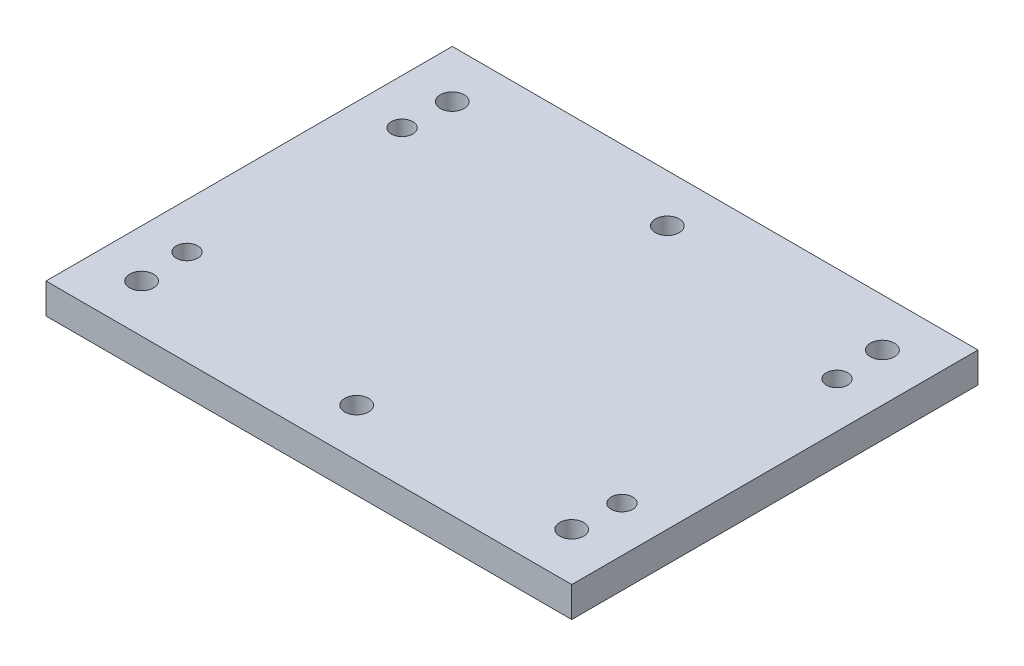
ISO-10303-21;
HEADER;
FILE_DESCRIPTION(('STEP AP214'),'2;1');
FILE_NAME('part.step','',(''),(''),'','','');
FILE_SCHEMA(('AUTOMOTIVE_DESIGN { 1 0 10303 214 1 1 1 1 }'));
ENDSEC;
DATA;
#1=APPLICATION_CONTEXT('core data for automotive mechanical design processes');
#2=APPLICATION_PROTOCOL_DEFINITION('international standard','automotive_design',2000,#1);
#3=PRODUCT_CONTEXT('',#1,'mechanical');
#4=PRODUCT('Part','Part','',(#3));
#5=PRODUCT_RELATED_PRODUCT_CATEGORY('part','',(#4));
#6=PRODUCT_DEFINITION_FORMATION('','',#4);
#7=PRODUCT_DEFINITION_CONTEXT('part definition',#1,'design');
#8=PRODUCT_DEFINITION('design','',#6,#7);
#9=PRODUCT_DEFINITION_SHAPE('','',#8);
#10=(LENGTH_UNIT() NAMED_UNIT(*) SI_UNIT(.MILLI.,.METRE.));
#11=(NAMED_UNIT(*) PLANE_ANGLE_UNIT() SI_UNIT($,.RADIAN.));
#12=(NAMED_UNIT(*) SI_UNIT($,.STERADIAN.) SOLID_ANGLE_UNIT());
#13=UNCERTAINTY_MEASURE_WITH_UNIT(LENGTH_MEASURE(1.E-05),#10,'distance_accuracy_value','');
#14=(GEOMETRIC_REPRESENTATION_CONTEXT(3) GLOBAL_UNCERTAINTY_ASSIGNED_CONTEXT((#13)) GLOBAL_UNIT_ASSIGNED_CONTEXT((#10,
#11,#12)) REPRESENTATION_CONTEXT('',''));
#15=CARTESIAN_POINT('',(0.,0.,0.));
#16=DIRECTION('',(0.,0.,1.));
#17=DIRECTION('',(1.,0.,0.));
#18=AXIS2_PLACEMENT_3D('',#15,#16,#17);
#19=CARTESIAN_POINT('',(55.,-3.175,-42.5));
#20=DIRECTION('',(1.,0.,0.));
#21=DIRECTION('',(0.,0.,-1.));
#22=AXIS2_PLACEMENT_3D('',#19,#20,#21);
#23=PLANE('',#22);
#24=DIRECTION('',(0.,1.,0.));
#25=VECTOR('',#24,1.);
#26=CARTESIAN_POINT('',(55.,-3.175,-42.5));
#27=LINE('',#26,#25);
#28=CARTESIAN_POINT('',(55.,-3.175,-42.5));
#29=VERTEX_POINT('',#28);
#30=CARTESIAN_POINT('',(55.,3.175,-42.5));
#31=VERTEX_POINT('',#30);
#32=EDGE_CURVE('E38',#29,#31,#27,.T.);
#33=ORIENTED_EDGE('',*,*,#32,.T.);
#34=DIRECTION('',(0.,0.,-1.));
#35=VECTOR('',#34,1.);
#36=CARTESIAN_POINT('',(55.,3.175,-42.5));
#37=LINE('',#36,#35);
#38=CARTESIAN_POINT('',(55.,3.175,42.5));
#39=VERTEX_POINT('',#38);
#40=EDGE_CURVE('E75',#39,#31,#37,.T.);
#41=ORIENTED_EDGE('',*,*,#40,.F.);
#42=DIRECTION('',(0.,1.,0.));
#43=VECTOR('',#42,1.);
#44=CARTESIAN_POINT('',(55.,-3.175,42.5));
#45=LINE('',#44,#43);
#46=CARTESIAN_POINT('',(55.,-3.175,42.5));
#47=VERTEX_POINT('',#46);
#48=EDGE_CURVE('E11',#47,#39,#45,.T.);
#49=ORIENTED_EDGE('',*,*,#48,.F.);
#50=DIRECTION('',(0.,0.,-1.));
#51=VECTOR('',#50,1.);
#52=CARTESIAN_POINT('',(55.,-3.175,-42.5));
#53=LINE('',#52,#51);
#54=EDGE_CURVE('E76',#47,#29,#53,.T.);
#55=ORIENTED_EDGE('',*,*,#54,.T.);
#56=EDGE_LOOP('',(#33,#41,#49,#55));
#57=FACE_BOUND('',#56,.T.);
#58=ADVANCED_FACE('F35',(#57),#23,.T.);
#59=CARTESIAN_POINT('',(-55.,-3.175,42.5));
#60=DIRECTION('',(0.,0.,1.));
#61=DIRECTION('',(1.,0.,0.));
#62=AXIS2_PLACEMENT_3D('',#59,#60,#61);
#63=PLANE('',#62);
#64=ORIENTED_EDGE('',*,*,#48,.T.);
#65=DIRECTION('',(1.,0.,0.));
#66=VECTOR('',#65,1.);
#67=CARTESIAN_POINT('',(-55.,3.175,42.5));
#68=LINE('',#67,#66);
#69=CARTESIAN_POINT('',(-55.,3.175,42.5));
#70=VERTEX_POINT('',#69);
#71=EDGE_CURVE('E93',#70,#39,#68,.T.);
#72=ORIENTED_EDGE('',*,*,#71,.F.);
#73=DIRECTION('',(0.,1.,0.));
#74=VECTOR('',#73,1.);
#75=CARTESIAN_POINT('',(-55.,-3.175,42.5));
#76=LINE('',#75,#74);
#77=CARTESIAN_POINT('',(-55.,-3.175,42.5));
#78=VERTEX_POINT('',#77);
#79=EDGE_CURVE('E43',#78,#70,#76,.T.);
#80=ORIENTED_EDGE('',*,*,#79,.F.);
#81=DIRECTION('',(1.,0.,0.));
#82=VECTOR('',#81,1.);
#83=CARTESIAN_POINT('',(-55.,-3.175,42.5));
#84=LINE('',#83,#82);
#85=EDGE_CURVE('E81',#78,#47,#84,.T.);
#86=ORIENTED_EDGE('',*,*,#85,.T.);
#87=EDGE_LOOP('',(#64,#72,#80,#86));
#88=FACE_BOUND('',#87,.T.);
#89=ADVANCED_FACE('F143',(#88),#63,.T.);
#90=CARTESIAN_POINT('',(-55.,-3.175,-42.5));
#91=DIRECTION('',(-1.,0.,0.));
#92=DIRECTION('',(0.,0.,1.));
#93=AXIS2_PLACEMENT_3D('',#90,#91,#92);
#94=PLANE('',#93);
#95=ORIENTED_EDGE('',*,*,#79,.T.);
#96=DIRECTION('',(0.,0.,1.));
#97=VECTOR('',#96,1.);
#98=CARTESIAN_POINT('',(-55.,3.175,-42.5));
#99=LINE('',#98,#97);
#100=CARTESIAN_POINT('',(-55.,3.175,-42.5));
#101=VERTEX_POINT('',#100);
#102=EDGE_CURVE('E88',#101,#70,#99,.T.);
#103=ORIENTED_EDGE('',*,*,#102,.F.);
#104=DIRECTION('',(0.,1.,0.));
#105=VECTOR('',#104,1.);
#106=CARTESIAN_POINT('',(-55.,-3.175,-42.5));
#107=LINE('',#106,#105);
#108=CARTESIAN_POINT('',(-55.,-3.175,-42.5));
#109=VERTEX_POINT('',#108);
#110=EDGE_CURVE('E80',#109,#101,#107,.T.);
#111=ORIENTED_EDGE('',*,*,#110,.F.);
#112=DIRECTION('',(0.,0.,1.));
#113=VECTOR('',#112,1.);
#114=CARTESIAN_POINT('',(-55.,-3.175,-42.5));
#115=LINE('',#114,#113);
#116=EDGE_CURVE('E136',#109,#78,#115,.T.);
#117=ORIENTED_EDGE('',*,*,#116,.T.);
#118=EDGE_LOOP('',(#95,#103,#111,#117));
#119=FACE_BOUND('',#118,.T.);
#120=ADVANCED_FACE('F140',(#119),#94,.T.);
#121=CARTESIAN_POINT('',(-55.,-3.175,-42.5));
#122=DIRECTION('',(0.,0.,-1.));
#123=DIRECTION('',(-1.,0.,0.));
#124=AXIS2_PLACEMENT_3D('',#121,#122,#123);
#125=PLANE('',#124);
#126=ORIENTED_EDGE('',*,*,#110,.T.);
#127=DIRECTION('',(-1.,0.,0.));
#128=VECTOR('',#127,1.);
#129=CARTESIAN_POINT('',(-55.,3.175,-42.5));
#130=LINE('',#129,#128);
#131=EDGE_CURVE('E83',#31,#101,#130,.T.);
#132=ORIENTED_EDGE('',*,*,#131,.F.);
#133=ORIENTED_EDGE('',*,*,#32,.F.);
#134=DIRECTION('',(-1.,0.,0.));
#135=VECTOR('',#134,1.);
#136=CARTESIAN_POINT('',(-55.,-3.175,-42.5));
#137=LINE('',#136,#135);
#138=EDGE_CURVE('E134',#29,#109,#137,.T.);
#139=ORIENTED_EDGE('',*,*,#138,.T.);
#140=EDGE_LOOP('',(#126,#132,#133,#139));
#141=FACE_BOUND('',#140,.T.);
#142=ADVANCED_FACE('F84',(#141),#125,.T.);
#143=CARTESIAN_POINT('',(0.,-3.175,0.));
#144=DIRECTION('',(0.,1.,0.));
#145=DIRECTION('',(0.,0.,1.));
#146=AXIS2_PLACEMENT_3D('',#143,#144,#145);
#147=PLANE('',#146);
#148=CARTESIAN_POINT('',(0.,-3.175,-32.5));
#149=DIRECTION('',(0.,1.,0.));
#150=DIRECTION('',(0.,0.,1.));
#151=AXIS2_PLACEMENT_3D('',#148,#149,#150);
#152=CIRCLE('',#151,2.5);
#153=CARTESIAN_POINT('',(0.,-3.175,-30.));
#154=VERTEX_POINT('',#153);
#155=EDGE_CURVE('E103',#154,#154,#152,.T.);
#156=ORIENTED_EDGE('',*,*,#155,.T.);
#157=EDGE_LOOP('',(#156));
#158=FACE_BOUND('',#157,.T.);
#159=CARTESIAN_POINT('',(0.,-3.175,32.5));
#160=DIRECTION('',(0.,1.,0.));
#161=DIRECTION('',(0.,0.,1.));
#162=AXIS2_PLACEMENT_3D('',#159,#160,#161);
#163=CIRCLE('',#162,2.5);
#164=CARTESIAN_POINT('',(0.,-3.175,35.));
#165=VERTEX_POINT('',#164);
#166=EDGE_CURVE('E106',#165,#165,#163,.T.);
#167=ORIENTED_EDGE('',*,*,#166,.T.);
#168=EDGE_LOOP('',(#167));
#169=FACE_BOUND('',#168,.T.);
#170=CARTESIAN_POINT('',(45.,-3.175,-32.5));
#171=DIRECTION('',(0.,1.,0.));
#172=DIRECTION('',(0.,0.,-1.));
#173=AXIS2_PLACEMENT_3D('',#170,#171,#172);
#174=CIRCLE('',#173,2.5);
#175=CARTESIAN_POINT('',(45.,-3.175,-35.));
#176=VERTEX_POINT('',#175);
#177=EDGE_CURVE('E109',#176,#176,#174,.T.);
#178=ORIENTED_EDGE('',*,*,#177,.T.);
#179=EDGE_LOOP('',(#178));
#180=FACE_BOUND('',#179,.T.);
#181=CARTESIAN_POINT('',(-45.,-3.175,-32.5));
#182=DIRECTION('',(0.,1.,0.));
#183=DIRECTION('',(0.,0.,1.));
#184=AXIS2_PLACEMENT_3D('',#181,#182,#183);
#185=CIRCLE('',#184,2.5);
#186=CARTESIAN_POINT('',(-45.,-3.175,-30.));
#187=VERTEX_POINT('',#186);
#188=EDGE_CURVE('E112',#187,#187,#185,.T.);
#189=ORIENTED_EDGE('',*,*,#188,.T.);
#190=EDGE_LOOP('',(#189));
#191=FACE_BOUND('',#190,.T.);
#192=CARTESIAN_POINT('',(-45.,-3.175,32.5));
#193=DIRECTION('',(0.,1.,0.));
#194=DIRECTION('',(0.,0.,-1.));
#195=AXIS2_PLACEMENT_3D('',#192,#193,#194);
#196=CIRCLE('',#195,2.5);
#197=CARTESIAN_POINT('',(-45.,-3.175,30.));
#198=VERTEX_POINT('',#197);
#199=EDGE_CURVE('E115',#198,#198,#196,.T.);
#200=ORIENTED_EDGE('',*,*,#199,.T.);
#201=EDGE_LOOP('',(#200));
#202=FACE_BOUND('',#201,.T.);
#203=CARTESIAN_POINT('',(45.,-3.175,32.5));
#204=DIRECTION('',(0.,1.,0.));
#205=DIRECTION('',(0.,0.,1.));
#206=AXIS2_PLACEMENT_3D('',#203,#204,#205);
#207=CIRCLE('',#206,2.5);
#208=CARTESIAN_POINT('',(45.,-3.175,35.));
#209=VERTEX_POINT('',#208);
#210=EDGE_CURVE('E118',#209,#209,#207,.T.);
#211=ORIENTED_EDGE('',*,*,#210,.T.);
#212=EDGE_LOOP('',(#211));
#213=FACE_BOUND('',#212,.T.);
#214=CARTESIAN_POINT('',(-45.5,-3.175,22.5));
#215=DIRECTION('',(0.,1.,0.));
#216=DIRECTION('',(0.,0.,-1.));
#217=AXIS2_PLACEMENT_3D('',#214,#215,#216);
#218=CIRCLE('',#217,2.25);
#219=CARTESIAN_POINT('',(-45.5,-3.175,20.25));
#220=VERTEX_POINT('',#219);
#221=EDGE_CURVE('E121',#220,#220,#218,.T.);
#222=ORIENTED_EDGE('',*,*,#221,.T.);
#223=EDGE_LOOP('',(#222));
#224=FACE_BOUND('',#223,.T.);
#225=CARTESIAN_POINT('',(45.5,-3.175,22.5));
#226=DIRECTION('',(0.,1.,0.));
#227=DIRECTION('',(0.,0.,1.));
#228=AXIS2_PLACEMENT_3D('',#225,#226,#227);
#229=CIRCLE('',#228,2.25000000000002);
#230=CARTESIAN_POINT('',(45.5,-3.175,24.75));
#231=VERTEX_POINT('',#230);
#232=EDGE_CURVE('E124',#231,#231,#229,.T.);
#233=ORIENTED_EDGE('',*,*,#232,.T.);
#234=EDGE_LOOP('',(#233));
#235=FACE_BOUND('',#234,.T.);
#236=CARTESIAN_POINT('',(45.5,-3.175,-22.5));
#237=DIRECTION('',(0.,1.,0.));
#238=DIRECTION('',(0.,0.,-1.));
#239=AXIS2_PLACEMENT_3D('',#236,#237,#238);
#240=CIRCLE('',#239,2.25000000000002);
#241=CARTESIAN_POINT('',(45.5,-3.175,-24.75));
#242=VERTEX_POINT('',#241);
#243=EDGE_CURVE('E127',#242,#242,#240,.T.);
#244=ORIENTED_EDGE('',*,*,#243,.T.);
#245=EDGE_LOOP('',(#244));
#246=FACE_BOUND('',#245,.T.);
#247=CARTESIAN_POINT('',(-45.5,-3.175,-22.5));
#248=DIRECTION('',(0.,1.,0.));
#249=DIRECTION('',(0.,0.,1.));
#250=AXIS2_PLACEMENT_3D('',#247,#248,#249);
#251=CIRCLE('',#250,2.25);
#252=CARTESIAN_POINT('',(-45.5,-3.175,-20.25));
#253=VERTEX_POINT('',#252);
#254=EDGE_CURVE('E130',#253,#253,#251,.T.);
#255=ORIENTED_EDGE('',*,*,#254,.T.);
#256=EDGE_LOOP('',(#255));
#257=FACE_BOUND('',#256,.T.);
#258=ORIENTED_EDGE('',*,*,#54,.F.);
#259=ORIENTED_EDGE('',*,*,#85,.F.);
#260=ORIENTED_EDGE('',*,*,#116,.F.);
#261=ORIENTED_EDGE('',*,*,#138,.F.);
#262=EDGE_LOOP('',(#258,#259,#260,#261));
#263=FACE_BOUND('',#262,.T.);
#264=ADVANCED_FACE('F145',(#158,#169,#180,#191,#202,#213,#224,#235,#246,#257,#263),#147,.F.);
#265=CARTESIAN_POINT('',(-45.5,-3.175,-22.5));
#266=DIRECTION('',(0.,1.,0.));
#267=DIRECTION('',(0.,0.,1.));
#268=AXIS2_PLACEMENT_3D('',#265,#266,#267);
#269=CYLINDRICAL_SURFACE('',#268,2.25);
#270=ORIENTED_EDGE('',*,*,#254,.F.);
#271=EDGE_LOOP('',(#270));
#272=FACE_BOUND('',#271,.T.);
#273=CARTESIAN_POINT('',(-45.5,3.175,-22.5));
#274=DIRECTION('',(0.,1.,0.));
#275=DIRECTION('',(0.,0.,1.));
#276=AXIS2_PLACEMENT_3D('',#273,#274,#275);
#277=CIRCLE('',#276,2.25);
#278=CARTESIAN_POINT('',(-45.5,3.175,-20.25));
#279=VERTEX_POINT('',#278);
#280=EDGE_CURVE('E94',#279,#279,#277,.T.);
#281=ORIENTED_EDGE('',*,*,#280,.T.);
#282=EDGE_LOOP('',(#281));
#283=FACE_BOUND('',#282,.T.);
#284=ADVANCED_FACE('F147',(#272,#283),#269,.F.);
#285=CARTESIAN_POINT('',(45.5,-3.175,-22.5));
#286=DIRECTION('',(0.,1.,0.));
#287=DIRECTION('',(0.,0.,1.));
#288=AXIS2_PLACEMENT_3D('',#285,#286,#287);
#289=CYLINDRICAL_SURFACE('',#288,2.25000000000002);
#290=ORIENTED_EDGE('',*,*,#243,.F.);
#291=EDGE_LOOP('',(#290));
#292=FACE_BOUND('',#291,.T.);
#293=CARTESIAN_POINT('',(45.5,3.175,-22.5));
#294=DIRECTION('',(0.,1.,0.));
#295=DIRECTION('',(0.,0.,-1.));
#296=AXIS2_PLACEMENT_3D('',#293,#294,#295);
#297=CIRCLE('',#296,2.25000000000002);
#298=CARTESIAN_POINT('',(45.5,3.175,-24.75));
#299=VERTEX_POINT('',#298);
#300=EDGE_CURVE('E97',#299,#299,#297,.T.);
#301=ORIENTED_EDGE('',*,*,#300,.T.);
#302=EDGE_LOOP('',(#301));
#303=FACE_BOUND('',#302,.T.);
#304=ADVANCED_FACE('F154',(#292,#303),#289,.F.);
#305=CARTESIAN_POINT('',(45.5,-3.175,22.5));
#306=DIRECTION('',(0.,1.,0.));
#307=DIRECTION('',(0.,0.,1.));
#308=AXIS2_PLACEMENT_3D('',#305,#306,#307);
#309=CYLINDRICAL_SURFACE('',#308,2.25000000000002);
#310=ORIENTED_EDGE('',*,*,#232,.F.);
#311=EDGE_LOOP('',(#310));
#312=FACE_BOUND('',#311,.T.);
#313=CARTESIAN_POINT('',(45.5,3.175,22.5));
#314=DIRECTION('',(0.,1.,0.));
#315=DIRECTION('',(0.,0.,1.));
#316=AXIS2_PLACEMENT_3D('',#313,#314,#315);
#317=CIRCLE('',#316,2.25000000000002);
#318=CARTESIAN_POINT('',(45.5,3.175,24.75));
#319=VERTEX_POINT('',#318);
#320=EDGE_CURVE('E300',#319,#319,#317,.T.);
#321=ORIENTED_EDGE('',*,*,#320,.T.);
#322=EDGE_LOOP('',(#321));
#323=FACE_BOUND('',#322,.T.);
#324=ADVANCED_FACE('F192',(#312,#323),#309,.F.);
#325=CARTESIAN_POINT('',(-45.5,-3.175,22.5));
#326=DIRECTION('',(0.,1.,0.));
#327=DIRECTION('',(0.,0.,1.));
#328=AXIS2_PLACEMENT_3D('',#325,#326,#327);
#329=CYLINDRICAL_SURFACE('',#328,2.25);
#330=ORIENTED_EDGE('',*,*,#221,.F.);
#331=EDGE_LOOP('',(#330));
#332=FACE_BOUND('',#331,.T.);
#333=CARTESIAN_POINT('',(-45.5,3.175,22.5));
#334=DIRECTION('',(0.,1.,0.));
#335=DIRECTION('',(0.,0.,-1.));
#336=AXIS2_PLACEMENT_3D('',#333,#334,#335);
#337=CIRCLE('',#336,2.25);
#338=CARTESIAN_POINT('',(-45.5,3.175,20.25));
#339=VERTEX_POINT('',#338);
#340=EDGE_CURVE('E304',#339,#339,#337,.T.);
#341=ORIENTED_EDGE('',*,*,#340,.T.);
#342=EDGE_LOOP('',(#341));
#343=FACE_BOUND('',#342,.T.);
#344=ADVANCED_FACE('F202',(#332,#343),#329,.F.);
#345=CARTESIAN_POINT('',(45.,-3.175,32.5));
#346=DIRECTION('',(0.,1.,0.));
#347=DIRECTION('',(0.,0.,1.));
#348=AXIS2_PLACEMENT_3D('',#345,#346,#347);
#349=CYLINDRICAL_SURFACE('',#348,2.5);
#350=ORIENTED_EDGE('',*,*,#210,.F.);
#351=EDGE_LOOP('',(#350));
#352=FACE_BOUND('',#351,.T.);
#353=CARTESIAN_POINT('',(45.,3.175,32.5));
#354=DIRECTION('',(0.,1.,0.));
#355=DIRECTION('',(0.,0.,1.));
#356=AXIS2_PLACEMENT_3D('',#353,#354,#355);
#357=CIRCLE('',#356,2.5);
#358=CARTESIAN_POINT('',(45.,3.175,35.));
#359=VERTEX_POINT('',#358);
#360=EDGE_CURVE('E296',#359,#359,#357,.T.);
#361=ORIENTED_EDGE('',*,*,#360,.T.);
#362=EDGE_LOOP('',(#361));
#363=FACE_BOUND('',#362,.T.);
#364=ADVANCED_FACE('F212',(#352,#363),#349,.F.);
#365=CARTESIAN_POINT('',(-45.,-3.175,32.5));
#366=DIRECTION('',(0.,1.,0.));
#367=DIRECTION('',(0.,0.,1.));
#368=AXIS2_PLACEMENT_3D('',#365,#366,#367);
#369=CYLINDRICAL_SURFACE('',#368,2.5);
#370=ORIENTED_EDGE('',*,*,#199,.F.);
#371=EDGE_LOOP('',(#370));
#372=FACE_BOUND('',#371,.T.);
#373=CARTESIAN_POINT('',(-45.,3.175,32.5));
#374=DIRECTION('',(0.,1.,0.));
#375=DIRECTION('',(0.,0.,-1.));
#376=AXIS2_PLACEMENT_3D('',#373,#374,#375);
#377=CIRCLE('',#376,2.5);
#378=CARTESIAN_POINT('',(-45.,3.175,30.));
#379=VERTEX_POINT('',#378);
#380=EDGE_CURVE('E311',#379,#379,#377,.T.);
#381=ORIENTED_EDGE('',*,*,#380,.T.);
#382=EDGE_LOOP('',(#381));
#383=FACE_BOUND('',#382,.T.);
#384=ADVANCED_FACE('F222',(#372,#383),#369,.F.);
#385=CARTESIAN_POINT('',(-45.,-3.175,-32.5));
#386=DIRECTION('',(0.,1.,0.));
#387=DIRECTION('',(0.,0.,1.));
#388=AXIS2_PLACEMENT_3D('',#385,#386,#387);
#389=CYLINDRICAL_SURFACE('',#388,2.5);
#390=ORIENTED_EDGE('',*,*,#188,.F.);
#391=EDGE_LOOP('',(#390));
#392=FACE_BOUND('',#391,.T.);
#393=CARTESIAN_POINT('',(-45.,3.175,-32.5));
#394=DIRECTION('',(0.,1.,0.));
#395=DIRECTION('',(0.,0.,1.));
#396=AXIS2_PLACEMENT_3D('',#393,#394,#395);
#397=CIRCLE('',#396,2.5);
#398=CARTESIAN_POINT('',(-45.,3.175,-30.));
#399=VERTEX_POINT('',#398);
#400=EDGE_CURVE('E292',#399,#399,#397,.T.);
#401=ORIENTED_EDGE('',*,*,#400,.T.);
#402=EDGE_LOOP('',(#401));
#403=FACE_BOUND('',#402,.T.);
#404=ADVANCED_FACE('F232',(#392,#403),#389,.F.);
#405=CARTESIAN_POINT('',(45.,-3.175,-32.5));
#406=DIRECTION('',(0.,1.,0.));
#407=DIRECTION('',(0.,0.,1.));
#408=AXIS2_PLACEMENT_3D('',#405,#406,#407);
#409=CYLINDRICAL_SURFACE('',#408,2.5);
#410=ORIENTED_EDGE('',*,*,#177,.F.);
#411=EDGE_LOOP('',(#410));
#412=FACE_BOUND('',#411,.T.);
#413=CARTESIAN_POINT('',(45.,3.175,-32.5));
#414=DIRECTION('',(0.,1.,0.));
#415=DIRECTION('',(0.,0.,-1.));
#416=AXIS2_PLACEMENT_3D('',#413,#414,#415);
#417=CIRCLE('',#416,2.5);
#418=CARTESIAN_POINT('',(45.,3.175,-35.));
#419=VERTEX_POINT('',#418);
#420=EDGE_CURVE('E315',#419,#419,#417,.T.);
#421=ORIENTED_EDGE('',*,*,#420,.T.);
#422=EDGE_LOOP('',(#421));
#423=FACE_BOUND('',#422,.T.);
#424=ADVANCED_FACE('F242',(#412,#423),#409,.F.);
#425=CARTESIAN_POINT('',(0.,-3.175,32.5));
#426=DIRECTION('',(0.,1.,0.));
#427=DIRECTION('',(0.,0.,1.));
#428=AXIS2_PLACEMENT_3D('',#425,#426,#427);
#429=CYLINDRICAL_SURFACE('',#428,2.5);
#430=ORIENTED_EDGE('',*,*,#166,.F.);
#431=EDGE_LOOP('',(#430));
#432=FACE_BOUND('',#431,.T.);
#433=CARTESIAN_POINT('',(0.,3.175,32.5));
#434=DIRECTION('',(0.,1.,0.));
#435=DIRECTION('',(0.,0.,1.));
#436=AXIS2_PLACEMENT_3D('',#433,#434,#435);
#437=CIRCLE('',#436,2.5);
#438=CARTESIAN_POINT('',(0.,3.175,35.));
#439=VERTEX_POINT('',#438);
#440=EDGE_CURVE('E288',#439,#439,#437,.T.);
#441=ORIENTED_EDGE('',*,*,#440,.T.);
#442=EDGE_LOOP('',(#441));
#443=FACE_BOUND('',#442,.T.);
#444=ADVANCED_FACE('F252',(#432,#443),#429,.F.);
#445=CARTESIAN_POINT('',(0.,-3.175,-32.5));
#446=DIRECTION('',(0.,1.,0.));
#447=DIRECTION('',(0.,0.,1.));
#448=AXIS2_PLACEMENT_3D('',#445,#446,#447);
#449=CYLINDRICAL_SURFACE('',#448,2.5);
#450=ORIENTED_EDGE('',*,*,#155,.F.);
#451=EDGE_LOOP('',(#450));
#452=FACE_BOUND('',#451,.T.);
#453=CARTESIAN_POINT('',(0.,3.175,-32.5));
#454=DIRECTION('',(0.,1.,0.));
#455=DIRECTION('',(0.,0.,1.));
#456=AXIS2_PLACEMENT_3D('',#453,#454,#455);
#457=CIRCLE('',#456,2.5);
#458=CARTESIAN_POINT('',(0.,3.175,-30.));
#459=VERTEX_POINT('',#458);
#460=EDGE_CURVE('E319',#459,#459,#457,.T.);
#461=ORIENTED_EDGE('',*,*,#460,.T.);
#462=EDGE_LOOP('',(#461));
#463=FACE_BOUND('',#462,.T.);
#464=ADVANCED_FACE('F262',(#452,#463),#449,.F.);
#465=CARTESIAN_POINT('',(0.,3.175,0.));
#466=DIRECTION('',(0.,1.,0.));
#467=DIRECTION('',(0.,0.,1.));
#468=AXIS2_PLACEMENT_3D('',#465,#466,#467);
#469=PLANE('',#468);
#470=ORIENTED_EDGE('',*,*,#440,.F.);
#471=EDGE_LOOP('',(#470));
#472=FACE_BOUND('',#471,.T.);
#473=ORIENTED_EDGE('',*,*,#400,.F.);
#474=EDGE_LOOP('',(#473));
#475=FACE_BOUND('',#474,.T.);
#476=ORIENTED_EDGE('',*,*,#360,.F.);
#477=EDGE_LOOP('',(#476));
#478=FACE_BOUND('',#477,.T.);
#479=ORIENTED_EDGE('',*,*,#320,.F.);
#480=EDGE_LOOP('',(#479));
#481=FACE_BOUND('',#480,.T.);
#482=ORIENTED_EDGE('',*,*,#280,.F.);
#483=EDGE_LOOP('',(#482));
#484=FACE_BOUND('',#483,.T.);
#485=ORIENTED_EDGE('',*,*,#40,.T.);
#486=ORIENTED_EDGE('',*,*,#131,.T.);
#487=ORIENTED_EDGE('',*,*,#102,.T.);
#488=ORIENTED_EDGE('',*,*,#71,.T.);
#489=EDGE_LOOP('',(#485,#486,#487,#488));
#490=FACE_BOUND('',#489,.T.);
#491=ORIENTED_EDGE('',*,*,#300,.F.);
#492=EDGE_LOOP('',(#491));
#493=FACE_BOUND('',#492,.T.);
#494=ORIENTED_EDGE('',*,*,#340,.F.);
#495=EDGE_LOOP('',(#494));
#496=FACE_BOUND('',#495,.T.);
#497=ORIENTED_EDGE('',*,*,#380,.F.);
#498=EDGE_LOOP('',(#497));
#499=FACE_BOUND('',#498,.T.);
#500=ORIENTED_EDGE('',*,*,#420,.F.);
#501=EDGE_LOOP('',(#500));
#502=FACE_BOUND('',#501,.T.);
#503=ORIENTED_EDGE('',*,*,#460,.F.);
#504=EDGE_LOOP('',(#503));
#505=FACE_BOUND('',#504,.T.);
#506=ADVANCED_FACE('F91',(#472,#475,#478,#481,#484,#490,#493,#496,#499,#502,#505),#469,.T.);
#507=CLOSED_SHELL('',(#58,#89,#120,#142,#264,#284,#304,#324,#344,#364,#384,#404,#424,#444,#464,#506));
#508=MANIFOLD_SOLID_BREP('B2',#507);
#509=ADVANCED_BREP_SHAPE_REPRESENTATION('',(#18,#508),#14);
#510=SHAPE_DEFINITION_REPRESENTATION(#9,#509);
ENDSEC;
END-ISO-10303-21;
